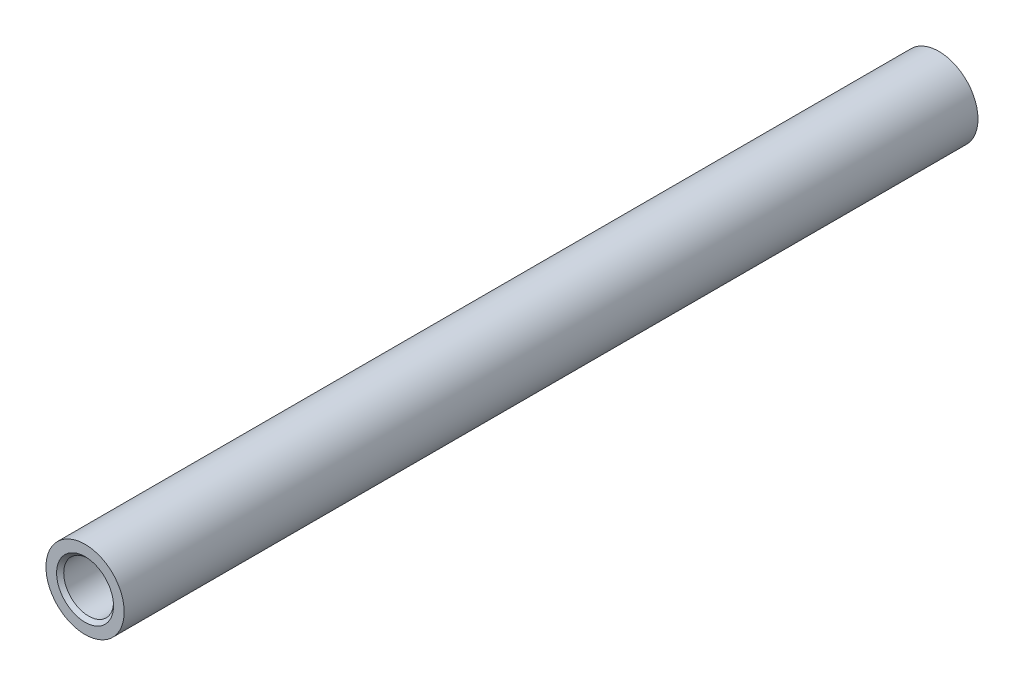
ISO-10303-21;
HEADER;
FILE_DESCRIPTION(('STEP AP214'),'2;1');
FILE_NAME('part.step','',(''),(''),'','','');
FILE_SCHEMA(('AUTOMOTIVE_DESIGN { 1 0 10303 214 1 1 1 1 }'));
ENDSEC;
DATA;
#1=APPLICATION_CONTEXT('core data for automotive mechanical design processes');
#2=APPLICATION_PROTOCOL_DEFINITION('international standard','automotive_design',2000,#1);
#3=PRODUCT_CONTEXT('',#1,'mechanical');
#4=PRODUCT('Part','Part','',(#3));
#5=PRODUCT_RELATED_PRODUCT_CATEGORY('part','',(#4));
#6=PRODUCT_DEFINITION_FORMATION('','',#4);
#7=PRODUCT_DEFINITION_CONTEXT('part definition',#1,'design');
#8=PRODUCT_DEFINITION('design','',#6,#7);
#9=PRODUCT_DEFINITION_SHAPE('','',#8);
#10=(LENGTH_UNIT() NAMED_UNIT(*) SI_UNIT(.MILLI.,.METRE.));
#11=(NAMED_UNIT(*) PLANE_ANGLE_UNIT() SI_UNIT($,.RADIAN.));
#12=(NAMED_UNIT(*) SI_UNIT($,.STERADIAN.) SOLID_ANGLE_UNIT());
#13=UNCERTAINTY_MEASURE_WITH_UNIT(LENGTH_MEASURE(1.E-05),#10,'distance_accuracy_value','');
#14=(GEOMETRIC_REPRESENTATION_CONTEXT(3) GLOBAL_UNCERTAINTY_ASSIGNED_CONTEXT((#13)) GLOBAL_UNIT_ASSIGNED_CONTEXT((#10,
#11,#12)) REPRESENTATION_CONTEXT('',''));
#15=CARTESIAN_POINT('',(0.,0.,0.));
#16=DIRECTION('',(0.,0.,1.));
#17=DIRECTION('',(1.,0.,0.));
#18=AXIS2_PLACEMENT_3D('',#15,#16,#17);
#19=CARTESIAN_POINT('',(0.,0.,120.));
#20=DIRECTION('',(0.,0.,-1.));
#21=DIRECTION('',(-1.,0.,0.));
#22=AXIS2_PLACEMENT_3D('',#19,#20,#21);
#23=CYLINDRICAL_SURFACE('',#22,7.);
#24=CARTESIAN_POINT('',(0.,0.,119.));
#25=DIRECTION('',(0.,0.,1.));
#26=DIRECTION('',(1.,0.,0.));
#27=AXIS2_PLACEMENT_3D('',#24,#25,#26);
#28=CIRCLE('',#27,7.);
#29=CARTESIAN_POINT('',(7.,0.,119.));
#30=VERTEX_POINT('',#29);
#31=EDGE_CURVE('E41',#30,#30,#28,.T.);
#32=ORIENTED_EDGE('',*,*,#31,.T.);
#33=EDGE_LOOP('',(#32));
#34=FACE_BOUND('',#33,.T.);
#35=CARTESIAN_POINT('',(0.,0.,-70.));
#36=DIRECTION('',(0.,0.,-1.));
#37=DIRECTION('',(-1.,0.,0.));
#38=AXIS2_PLACEMENT_3D('',#35,#36,#37);
#39=CIRCLE('',#38,7.);
#40=CARTESIAN_POINT('',(-7.,0.,-70.));
#41=VERTEX_POINT('',#40);
#42=EDGE_CURVE('E52',#41,#41,#39,.T.);
#43=ORIENTED_EDGE('',*,*,#42,.T.);
#44=EDGE_LOOP('',(#43));
#45=FACE_BOUND('',#44,.T.);
#46=ADVANCED_FACE('F33',(#34,#45),#23,.F.);
#47=CARTESIAN_POINT('',(0.,0.,120.));
#48=DIRECTION('',(0.,0.,1.));
#49=DIRECTION('',(1.,0.,0.));
#50=AXIS2_PLACEMENT_3D('',#47,#48,#49);
#51=PLANE('',#50);
#52=CARTESIAN_POINT('',(0.,0.,120.));
#53=DIRECTION('',(0.,0.,1.));
#54=DIRECTION('',(1.,0.,0.));
#55=AXIS2_PLACEMENT_3D('',#52,#53,#54);
#56=CIRCLE('',#55,8.00000000000009);
#57=CARTESIAN_POINT('',(8.00000000000009,0.,120.));
#58=VERTEX_POINT('',#57);
#59=EDGE_CURVE('E10',#58,#58,#56,.F.);
#60=ORIENTED_EDGE('',*,*,#59,.T.);
#61=EDGE_LOOP('',(#60));
#62=FACE_BOUND('',#61,.T.);
#63=CARTESIAN_POINT('',(0.,0.,120.));
#64=DIRECTION('',(0.,0.,1.));
#65=DIRECTION('',(1.,0.,0.));
#66=AXIS2_PLACEMENT_3D('',#63,#64,#65);
#67=CIRCLE('',#66,11.);
#68=CARTESIAN_POINT('',(11.,0.,120.));
#69=VERTEX_POINT('',#68);
#70=EDGE_CURVE('E45',#69,#69,#67,.T.);
#71=ORIENTED_EDGE('',*,*,#70,.T.);
#72=EDGE_LOOP('',(#71));
#73=FACE_BOUND('',#72,.T.);
#74=ADVANCED_FACE('F76',(#62,#73),#51,.T.);
#75=CARTESIAN_POINT('',(0.,0.,-120.));
#76=DIRECTION('',(0.,0.,1.));
#77=DIRECTION('',(1.,0.,0.));
#78=AXIS2_PLACEMENT_3D('',#75,#76,#77);
#79=PLANE('',#78);
#80=CARTESIAN_POINT('',(0.,0.,-120.));
#81=DIRECTION('',(0.,0.,-1.));
#82=DIRECTION('',(-1.,0.,0.));
#83=AXIS2_PLACEMENT_3D('',#80,#81,#82);
#84=CIRCLE('',#83,8.);
#85=CARTESIAN_POINT('',(-8.,0.,-120.));
#86=VERTEX_POINT('',#85);
#87=EDGE_CURVE('E58',#86,#86,#84,.T.);
#88=ORIENTED_EDGE('',*,*,#87,.F.);
#89=EDGE_LOOP('',(#88));
#90=FACE_BOUND('',#89,.T.);
#91=CARTESIAN_POINT('',(0.,0.,-120.));
#92=DIRECTION('',(0.,0.,1.));
#93=DIRECTION('',(1.,0.,0.));
#94=AXIS2_PLACEMENT_3D('',#91,#92,#93);
#95=CIRCLE('',#94,11.);
#96=CARTESIAN_POINT('',(11.,0.,-120.));
#97=VERTEX_POINT('',#96);
#98=EDGE_CURVE('E49',#97,#97,#95,.T.);
#99=ORIENTED_EDGE('',*,*,#98,.F.);
#100=EDGE_LOOP('',(#99));
#101=FACE_BOUND('',#100,.T.);
#102=ADVANCED_FACE('F73',(#90,#101),#79,.F.);
#103=CARTESIAN_POINT('',(0.,0.,120.));
#104=DIRECTION('',(0.,0.,-1.));
#105=DIRECTION('',(-1.,0.,0.));
#106=AXIS2_PLACEMENT_3D('',#103,#104,#105);
#107=CYLINDRICAL_SURFACE('',#106,11.);
#108=ORIENTED_EDGE('',*,*,#70,.F.);
#109=EDGE_LOOP('',(#108));
#110=FACE_BOUND('',#109,.T.);
#111=ORIENTED_EDGE('',*,*,#98,.T.);
#112=EDGE_LOOP('',(#111));
#113=FACE_BOUND('',#112,.T.);
#114=ADVANCED_FACE('F69',(#110,#113),#107,.T.);
#115=CARTESIAN_POINT('',(0.,0.,-70.));
#116=DIRECTION('',(0.,0.,-1.));
#117=DIRECTION('',(-1.,0.,0.));
#118=AXIS2_PLACEMENT_3D('',#115,#116,#117);
#119=CYLINDRICAL_SURFACE('',#118,8.);
#120=CARTESIAN_POINT('',(0.,0.,-70.));
#121=DIRECTION('',(0.,0.,-1.));
#122=DIRECTION('',(-1.,0.,0.));
#123=AXIS2_PLACEMENT_3D('',#120,#121,#122);
#124=CIRCLE('',#123,8.);
#125=CARTESIAN_POINT('',(-8.,0.,-70.));
#126=VERTEX_POINT('',#125);
#127=EDGE_CURVE('E55',#126,#126,#124,.T.);
#128=ORIENTED_EDGE('',*,*,#127,.F.);
#129=EDGE_LOOP('',(#128));
#130=FACE_BOUND('',#129,.T.);
#131=ORIENTED_EDGE('',*,*,#87,.T.);
#132=EDGE_LOOP('',(#131));
#133=FACE_BOUND('',#132,.T.);
#134=ADVANCED_FACE('F66',(#130,#133),#119,.F.);
#135=CARTESIAN_POINT('',(0.,0.,-70.));
#136=DIRECTION('',(0.,0.,-1.));
#137=DIRECTION('',(-1.,0.,0.));
#138=AXIS2_PLACEMENT_3D('',#135,#136,#137);
#139=PLANE('',#138);
#140=ORIENTED_EDGE('',*,*,#42,.F.);
#141=EDGE_LOOP('',(#140));
#142=FACE_BOUND('',#141,.T.);
#143=ORIENTED_EDGE('',*,*,#127,.T.);
#144=EDGE_LOOP('',(#143));
#145=FACE_BOUND('',#144,.T.);
#146=ADVANCED_FACE('F64',(#142,#145),#139,.T.);
#147=CARTESIAN_POINT('',(0.,0.,119.));
#148=DIRECTION('',(0.,0.,1.));
#149=DIRECTION('',(1.,0.,0.));
#150=AXIS2_PLACEMENT_3D('',#147,#148,#149);
#151=CONICAL_SURFACE('',#150,7.,0.785398163397459);
#152=ORIENTED_EDGE('',*,*,#59,.F.);
#153=EDGE_LOOP('',(#152));
#154=FACE_BOUND('',#153,.T.);
#155=ORIENTED_EDGE('',*,*,#31,.F.);
#156=EDGE_LOOP('',(#155));
#157=FACE_BOUND('',#156,.T.);
#158=ADVANCED_FACE('F36',(#154,#157),#151,.F.);
#159=CLOSED_SHELL('',(#46,#74,#102,#114,#134,#146,#158));
#160=MANIFOLD_SOLID_BREP('B2',#159);
#161=ADVANCED_BREP_SHAPE_REPRESENTATION('',(#18,#160),#14);
#162=SHAPE_DEFINITION_REPRESENTATION(#9,#161);
ENDSEC;
END-ISO-10303-21;
